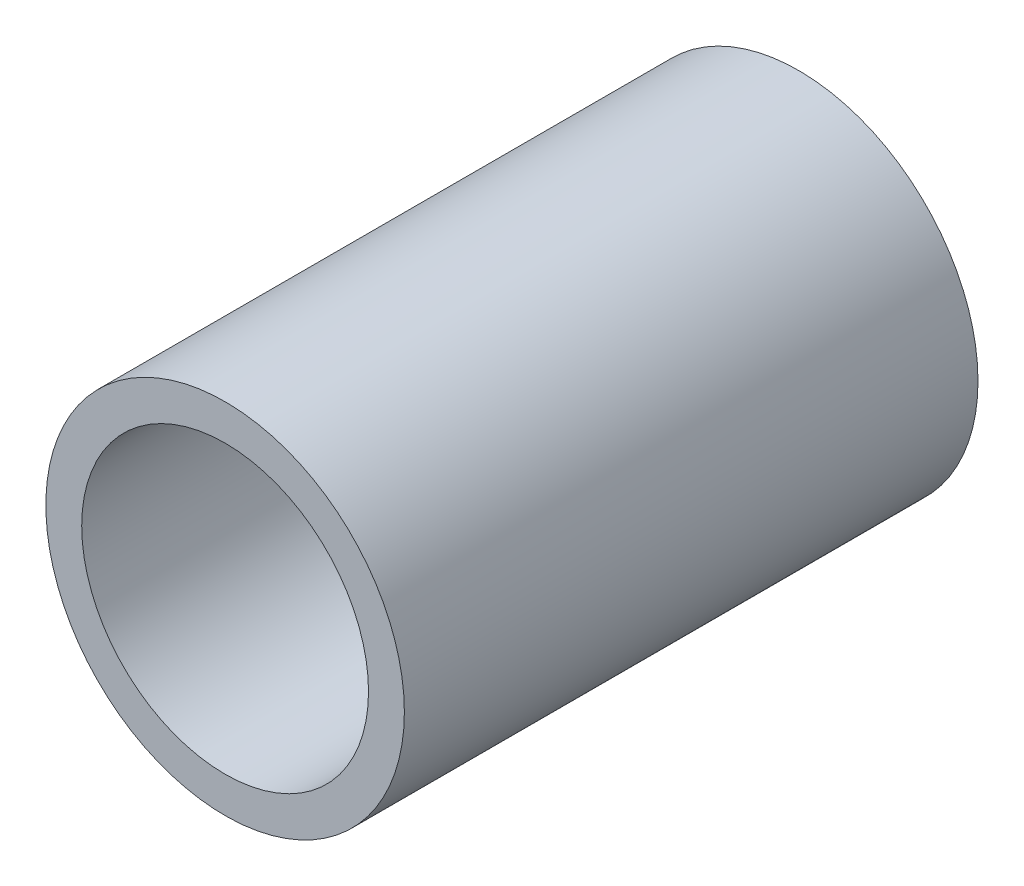
ISO-10303-21;
HEADER;
FILE_DESCRIPTION(('STEP AP214'),'2;1');
FILE_NAME('part.step','',(''),(''),'','','');
FILE_SCHEMA(('AUTOMOTIVE_DESIGN { 1 0 10303 214 1 1 1 1 }'));
ENDSEC;
DATA;
#1=APPLICATION_CONTEXT('core data for automotive mechanical design processes');
#2=APPLICATION_PROTOCOL_DEFINITION('international standard','automotive_design',2000,#1);
#3=PRODUCT_CONTEXT('',#1,'mechanical');
#4=PRODUCT('Part','Part','',(#3));
#5=PRODUCT_RELATED_PRODUCT_CATEGORY('part','',(#4));
#6=PRODUCT_DEFINITION_FORMATION('','',#4);
#7=PRODUCT_DEFINITION_CONTEXT('part definition',#1,'design');
#8=PRODUCT_DEFINITION('design','',#6,#7);
#9=PRODUCT_DEFINITION_SHAPE('','',#8);
#10=(LENGTH_UNIT() NAMED_UNIT(*) SI_UNIT(.MILLI.,.METRE.));
#11=(NAMED_UNIT(*) PLANE_ANGLE_UNIT() SI_UNIT($,.RADIAN.));
#12=(NAMED_UNIT(*) SI_UNIT($,.STERADIAN.) SOLID_ANGLE_UNIT());
#13=UNCERTAINTY_MEASURE_WITH_UNIT(LENGTH_MEASURE(1.E-05),#10,'distance_accuracy_value','');
#14=(GEOMETRIC_REPRESENTATION_CONTEXT(3) GLOBAL_UNCERTAINTY_ASSIGNED_CONTEXT((#13)) GLOBAL_UNIT_ASSIGNED_CONTEXT((#10,
#11,#12)) REPRESENTATION_CONTEXT('',''));
#15=CARTESIAN_POINT('',(0.,0.,0.));
#16=DIRECTION('',(0.,0.,1.));
#17=DIRECTION('',(1.,0.,0.));
#18=AXIS2_PLACEMENT_3D('',#15,#16,#17);
#19=CARTESIAN_POINT('',(0.,0.,6.35));
#20=DIRECTION('',(0.,0.,1.));
#21=DIRECTION('',(1.,0.,0.));
#22=AXIS2_PLACEMENT_3D('',#19,#20,#21);
#23=PLANE('',#22);
#24=CARTESIAN_POINT('',(0.,0.,6.35));
#25=DIRECTION('',(0.,0.,1.));
#26=DIRECTION('',(1.,0.,0.));
#27=AXIS2_PLACEMENT_3D('',#24,#25,#26);
#28=CIRCLE('',#27,3.96875);
#29=CARTESIAN_POINT('',(3.96875,0.,6.35));
#30=VERTEX_POINT('',#29);
#31=EDGE_CURVE('E10',#30,#30,#28,.T.);
#32=ORIENTED_EDGE('',*,*,#31,.T.);
#33=EDGE_LOOP('',(#32));
#34=FACE_BOUND('',#33,.T.);
#35=CARTESIAN_POINT('',(0.,0.,6.35));
#36=DIRECTION('',(0.,0.,1.));
#37=DIRECTION('',(1.,0.,0.));
#38=AXIS2_PLACEMENT_3D('',#35,#36,#37);
#39=CIRCLE('',#38,3.175);
#40=CARTESIAN_POINT('',(3.175,0.,6.35));
#41=VERTEX_POINT('',#40);
#42=EDGE_CURVE('E41',#41,#41,#39,.T.);
#43=ORIENTED_EDGE('',*,*,#42,.F.);
#44=EDGE_LOOP('',(#43));
#45=FACE_BOUND('',#44,.T.);
#46=ADVANCED_FACE('F30',(#34,#45),#23,.T.);
#47=CARTESIAN_POINT('',(0.,0.,-6.35));
#48=DIRECTION('',(0.,0.,1.));
#49=DIRECTION('',(1.,0.,0.));
#50=AXIS2_PLACEMENT_3D('',#47,#48,#49);
#51=PLANE('',#50);
#52=CARTESIAN_POINT('',(0.,0.,-6.35));
#53=DIRECTION('',(0.,0.,1.));
#54=DIRECTION('',(1.,0.,0.));
#55=AXIS2_PLACEMENT_3D('',#52,#53,#54);
#56=CIRCLE('',#55,3.96875);
#57=CARTESIAN_POINT('',(3.96875,0.,-6.35));
#58=VERTEX_POINT('',#57);
#59=EDGE_CURVE('E34',#58,#58,#56,.T.);
#60=ORIENTED_EDGE('',*,*,#59,.F.);
#61=EDGE_LOOP('',(#60));
#62=FACE_BOUND('',#61,.T.);
#63=CARTESIAN_POINT('',(0.,0.,-6.35));
#64=DIRECTION('',(0.,0.,1.));
#65=DIRECTION('',(1.,0.,0.));
#66=AXIS2_PLACEMENT_3D('',#63,#64,#65);
#67=CIRCLE('',#66,3.175);
#68=CARTESIAN_POINT('',(3.175,0.,-6.35));
#69=VERTEX_POINT('',#68);
#70=EDGE_CURVE('E43',#69,#69,#67,.T.);
#71=ORIENTED_EDGE('',*,*,#70,.T.);
#72=EDGE_LOOP('',(#71));
#73=FACE_BOUND('',#72,.T.);
#74=ADVANCED_FACE('F53',(#62,#73),#51,.F.);
#75=CARTESIAN_POINT('',(0.,0.,6.35));
#76=DIRECTION('',(0.,0.,-1.));
#77=DIRECTION('',(-1.,0.,0.));
#78=AXIS2_PLACEMENT_3D('',#75,#76,#77);
#79=CYLINDRICAL_SURFACE('',#78,3.96875);
#80=ORIENTED_EDGE('',*,*,#31,.F.);
#81=EDGE_LOOP('',(#80));
#82=FACE_BOUND('',#81,.T.);
#83=ORIENTED_EDGE('',*,*,#59,.T.);
#84=EDGE_LOOP('',(#83));
#85=FACE_BOUND('',#84,.T.);
#86=ADVANCED_FACE('F32',(#82,#85),#79,.T.);
#87=CARTESIAN_POINT('',(0.,0.,6.35));
#88=DIRECTION('',(0.,0.,-1.));
#89=DIRECTION('',(-1.,0.,0.));
#90=AXIS2_PLACEMENT_3D('',#87,#88,#89);
#91=CYLINDRICAL_SURFACE('',#90,3.175);
#92=ORIENTED_EDGE('',*,*,#42,.T.);
#93=EDGE_LOOP('',(#92));
#94=FACE_BOUND('',#93,.T.);
#95=ORIENTED_EDGE('',*,*,#70,.F.);
#96=EDGE_LOOP('',(#95));
#97=FACE_BOUND('',#96,.T.);
#98=ADVANCED_FACE('F49',(#94,#97),#91,.F.);
#99=CLOSED_SHELL('',(#46,#74,#86,#98));
#100=MANIFOLD_SOLID_BREP('B2',#99);
#101=ADVANCED_BREP_SHAPE_REPRESENTATION('',(#18,#100),#14);
#102=SHAPE_DEFINITION_REPRESENTATION(#9,#101);
ENDSEC;
END-ISO-10303-21;
